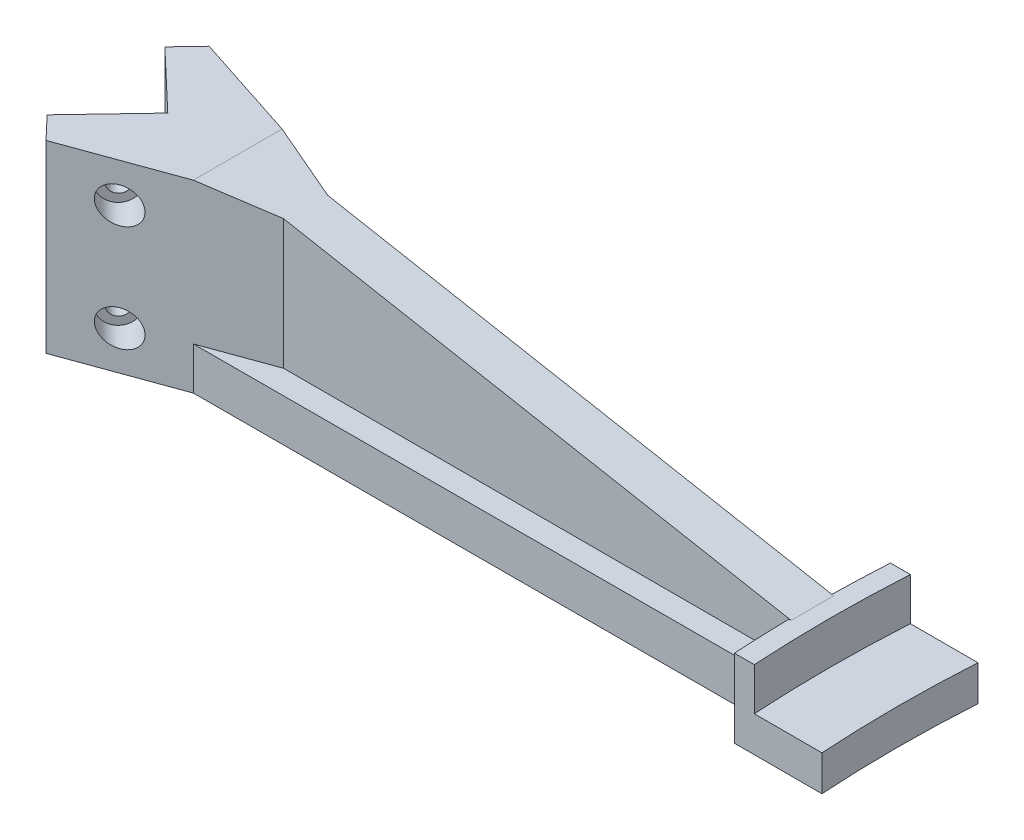
ISO-10303-21;
HEADER;
FILE_DESCRIPTION(('STEP AP214'),'2;1');
FILE_NAME('part.step','',(''),(''),'','','');
FILE_SCHEMA(('AUTOMOTIVE_DESIGN { 1 0 10303 214 1 1 1 1 }'));
ENDSEC;
DATA;
#1=APPLICATION_CONTEXT('core data for automotive mechanical design processes');
#2=APPLICATION_PROTOCOL_DEFINITION('international standard','automotive_design',2000,#1);
#3=PRODUCT_CONTEXT('',#1,'mechanical');
#4=PRODUCT('Part','Part','',(#3));
#5=PRODUCT_RELATED_PRODUCT_CATEGORY('part','',(#4));
#6=PRODUCT_DEFINITION_FORMATION('','',#4);
#7=PRODUCT_DEFINITION_CONTEXT('part definition',#1,'design');
#8=PRODUCT_DEFINITION('design','',#6,#7);
#9=PRODUCT_DEFINITION_SHAPE('','',#8);
#10=(LENGTH_UNIT() NAMED_UNIT(*) SI_UNIT(.MILLI.,.METRE.));
#11=(NAMED_UNIT(*) PLANE_ANGLE_UNIT() SI_UNIT($,.RADIAN.));
#12=(NAMED_UNIT(*) SI_UNIT($,.STERADIAN.) SOLID_ANGLE_UNIT());
#13=UNCERTAINTY_MEASURE_WITH_UNIT(LENGTH_MEASURE(1.E-05),#10,'distance_accuracy_value','');
#14=(GEOMETRIC_REPRESENTATION_CONTEXT(3) GLOBAL_UNCERTAINTY_ASSIGNED_CONTEXT((#13)) GLOBAL_UNIT_ASSIGNED_CONTEXT((#10,
#11,#12)) REPRESENTATION_CONTEXT('',''));
#15=CARTESIAN_POINT('',(0.,0.,0.));
#16=DIRECTION('',(0.,0.,1.));
#17=DIRECTION('',(1.,0.,0.));
#18=AXIS2_PLACEMENT_3D('',#15,#16,#17);
#19=CARTESIAN_POINT('',(-14.677433010329,-12.,-40.4115677614171));
#20=DIRECTION('',(0.341379794654496,0.,0.939925441618458));
#21=DIRECTION('',(0.939925441618459,0.,-0.341379794654496));
#22=AXIS2_PLACEMENT_3D('',#19,#20,#21);
#23=PLANE('',#22);
#24=CARTESIAN_POINT('',(-176.366171619887,29.,18.3135884482406));
#25=DIRECTION('',(0.341379794654496,0.,0.939925441618458));
#26=DIRECTION('',(-0.939925441618459,0.,0.341379794654496));
#27=AXIS2_PLACEMENT_3D('',#24,#25,#26);
#28=ELLIPSE('',#27,5.58738315295416,4.99999999999998);
#29=CARTESIAN_POINT('',(-181.617895197419,29.,20.2210081616521));
#30=VERTEX_POINT('',#29);
#31=EDGE_CURVE('E191',#30,#30,#28,.T.);
#32=ORIENTED_EDGE('',*,*,#31,.F.);
#33=EDGE_LOOP('',(#32));
#34=FACE_BOUND('',#33,.T.);
#35=CARTESIAN_POINT('',(-176.366171619887,-0.999999999999997,18.3135884482406));
#36=DIRECTION('',(0.341379794654496,0.,0.939925441618458));
#37=DIRECTION('',(-0.939925441618459,0.,0.341379794654496));
#38=AXIS2_PLACEMENT_3D('',#35,#36,#37);
#39=ELLIPSE('',#38,5.58738315295416,4.99999999999998);
#40=CARTESIAN_POINT('',(-181.617895197419,-0.999999999999997,20.2210081616521));
#41=VERTEX_POINT('',#40);
#42=EDGE_CURVE('E322',#41,#41,#39,.T.);
#43=ORIENTED_EDGE('',*,*,#42,.F.);
#44=EDGE_LOOP('',(#43));
#45=FACE_BOUND('',#44,.T.);
#46=DIRECTION('',(0.,1.,0.));
#47=VECTOR('',#46,1.);
#48=CARTESIAN_POINT('',(-142.463007925521,-12.,6.));
#49=LINE('',#48,#47);
#50=CARTESIAN_POINT('',(-142.463007925521,0.,6.));
#51=VERTEX_POINT('',#50);
#52=CARTESIAN_POINT('',(-142.463007925521,36.5394166426613,6.));
#53=VERTEX_POINT('',#52);
#54=EDGE_CURVE('E198',#51,#53,#49,.T.);
#55=ORIENTED_EDGE('',*,*,#54,.T.);
#56=DIRECTION('',(-0.925965204122098,0.171710199172954,0.336309453115885));
#57=VECTOR('',#56,1.);
#58=CARTESIAN_POINT('',(-10.72745892573,12.1104885833626,-41.8461936180905));
#59=LINE('',#58,#57);
#60=CARTESIAN_POINT('',(-161.12456554,40.,12.7778553747775));
#61=VERTEX_POINT('',#60);
#62=EDGE_CURVE('E185',#53,#61,#59,.T.);
#63=ORIENTED_EDGE('',*,*,#62,.T.);
#64=DIRECTION('',(0.939925441618459,0.,-0.341379794654496));
#65=VECTOR('',#64,1.);
#66=CARTESIAN_POINT('',(-14.677433010329,40.,-40.4115677614171));
#67=LINE('',#66,#65);
#68=CARTESIAN_POINT('',(-191.610767905309,40.,23.8504075607723));
#69=VERTEX_POINT('',#68);
#70=EDGE_CURVE('E196',#69,#61,#67,.T.);
#71=ORIENTED_EDGE('',*,*,#70,.F.);
#72=DIRECTION('',(0.,1.,0.));
#73=VECTOR('',#72,1.);
#74=CARTESIAN_POINT('',(-191.610767905309,-12.,23.8504075607723));
#75=LINE('',#74,#73);
#76=CARTESIAN_POINT('',(-191.610767905309,-12.,23.8504075607723));
#77=VERTEX_POINT('',#76);
#78=EDGE_CURVE('E296',#77,#69,#75,.T.);
#79=ORIENTED_EDGE('',*,*,#78,.F.);
#80=DIRECTION('',(0.939925441618459,0.,-0.341379794654496));
#81=VECTOR('',#80,1.);
#82=CARTESIAN_POINT('',(-14.677433010329,-12.,-40.4115677614171));
#83=LINE('',#82,#81);
#84=CARTESIAN_POINT('',(-161.12456554,-12.,12.7778553747776));
#85=VERTEX_POINT('',#84);
#86=EDGE_CURVE('E285',#77,#85,#83,.T.);
#87=ORIENTED_EDGE('',*,*,#86,.T.);
#88=DIRECTION('',(0.,1.,0.));
#89=VECTOR('',#88,1.);
#90=CARTESIAN_POINT('',(-161.12456554,-12.,12.7778553747776));
#91=LINE('',#90,#89);
#92=CARTESIAN_POINT('',(-161.12456554,0.,12.7778553747776));
#93=VERTEX_POINT('',#92);
#94=EDGE_CURVE('E293',#85,#93,#91,.T.);
#95=ORIENTED_EDGE('',*,*,#94,.T.);
#96=DIRECTION('',(0.939925441618459,0.,-0.341379794654496));
#97=VECTOR('',#96,1.);
#98=CARTESIAN_POINT('',(-14.677433010329,0.,-40.4115677614171));
#99=LINE('',#98,#97);
#100=EDGE_CURVE('E211',#93,#51,#99,.T.);
#101=ORIENTED_EDGE('',*,*,#100,.T.);
#102=EDGE_LOOP('',(#55,#63,#71,#79,#87,#95,#101));
#103=FACE_BOUND('',#102,.T.);
#104=ADVANCED_FACE('F39',(#34,#45,#103),#23,.T.);
#105=CARTESIAN_POINT('',(-11.8491370737928,-12.,36.3875184693806));
#106=DIRECTION('',(-0.309634199461379,0.,0.950855752742713));
#107=DIRECTION('',(0.950855752742713,0.,0.309634199461379));
#108=AXIS2_PLACEMENT_3D('',#105,#106,#107);
#109=PLANE('',#108);
#110=CARTESIAN_POINT('',(-177.25059753382,29.,-17.4733838300045));
#111=DIRECTION('',(-0.309634199461379,0.,0.950855752742713));
#112=DIRECTION('',(-0.950855752742713,0.,-0.309634199461379));
#113=AXIS2_PLACEMENT_3D('',#110,#111,#112);
#114=ELLIPSE('',#113,5.68578526215447,4.99999999999998);
#115=CARTESIAN_POINT('',(-182.656959159199,29.,-19.233897397961));
#116=VERTEX_POINT('',#115);
#117=EDGE_CURVE('E332',#116,#116,#114,.F.);
#118=ORIENTED_EDGE('',*,*,#117,.F.);
#119=EDGE_LOOP('',(#118));
#120=FACE_BOUND('',#119,.T.);
#121=CARTESIAN_POINT('',(-177.25059753382,-0.999999999999997,-17.4733838300045));
#122=DIRECTION('',(-0.309634199461379,0.,0.950855752742713));
#123=DIRECTION('',(-0.950855752742713,0.,-0.309634199461379));
#124=AXIS2_PLACEMENT_3D('',#121,#122,#123);
#125=ELLIPSE('',#124,5.68578526215447,4.99999999999998);
#126=CARTESIAN_POINT('',(-182.656959159199,-0.999999999999997,-19.233897397961));
#127=VERTEX_POINT('',#126);
#128=EDGE_CURVE('E337',#127,#127,#125,.F.);
#129=ORIENTED_EDGE('',*,*,#128,.F.);
#130=EDGE_LOOP('',(#129));
#131=FACE_BOUND('',#130,.T.);
#132=DIRECTION('',(-0.936410293348021,0.173647127627045,-0.304930217556));
#133=VECTOR('',#132,1.);
#134=CARTESIAN_POINT('',(-7.89482977141085,11.5852082444189,37.6751888362745));
#135=LINE('',#134,#133);
#136=CARTESIAN_POINT('',(-142.016979809542,36.4567055685404,-6.));
#137=VERTEX_POINT('',#136);
#138=CARTESIAN_POINT('',(-161.12456554,40.,-12.2221446252225));
#139=VERTEX_POINT('',#138);
#140=EDGE_CURVE('E56',#137,#139,#135,.T.);
#141=ORIENTED_EDGE('',*,*,#140,.F.);
#142=DIRECTION('',(0.,-1.,0.));
#143=VECTOR('',#142,1.);
#144=CARTESIAN_POINT('',(-142.016979809542,-12.,-6.));
#145=LINE('',#144,#143);
#146=CARTESIAN_POINT('',(-142.016979809542,0.,-6.));
#147=VERTEX_POINT('',#146);
#148=EDGE_CURVE('E214',#137,#147,#145,.T.);
#149=ORIENTED_EDGE('',*,*,#148,.T.);
#150=DIRECTION('',(0.950855752742713,0.,0.309634199461379));
#151=VECTOR('',#150,1.);
#152=CARTESIAN_POINT('',(-11.8491370737928,0.,36.3875184693806));
#153=LINE('',#152,#151);
#154=CARTESIAN_POINT('',(-161.12456554,0.,-12.2221446252224));
#155=VERTEX_POINT('',#154);
#156=EDGE_CURVE('E206',#155,#147,#153,.T.);
#157=ORIENTED_EDGE('',*,*,#156,.F.);
#158=DIRECTION('',(0.,1.,0.));
#159=VECTOR('',#158,1.);
#160=CARTESIAN_POINT('',(-161.12456554,-12.,-12.2221446252224));
#161=LINE('',#160,#159);
#162=CARTESIAN_POINT('',(-161.12456554,-12.,-12.2221446252224));
#163=VERTEX_POINT('',#162);
#164=EDGE_CURVE('E306',#163,#155,#161,.T.);
#165=ORIENTED_EDGE('',*,*,#164,.F.);
#166=DIRECTION('',(0.950855752742713,0.,0.309634199461379));
#167=VECTOR('',#166,1.);
#168=CARTESIAN_POINT('',(-11.8491370737928,-12.,36.3875184693806));
#169=LINE('',#168,#167);
#170=CARTESIAN_POINT('',(-191.610767905309,-12.,-22.1495924392277));
#171=VERTEX_POINT('',#170);
#172=EDGE_CURVE('E273',#171,#163,#169,.T.);
#173=ORIENTED_EDGE('',*,*,#172,.F.);
#174=DIRECTION('',(0.,1.,0.));
#175=VECTOR('',#174,1.);
#176=CARTESIAN_POINT('',(-191.610767905309,-12.,-22.1495924392277));
#177=LINE('',#176,#175);
#178=CARTESIAN_POINT('',(-191.610767905309,40.,-22.1495924392277));
#179=VERTEX_POINT('',#178);
#180=EDGE_CURVE('E304',#171,#179,#177,.T.);
#181=ORIENTED_EDGE('',*,*,#180,.T.);
#182=DIRECTION('',(0.950855752742713,0.,0.309634199461379));
#183=VECTOR('',#182,1.);
#184=CARTESIAN_POINT('',(-11.8491370737928,40.,36.3875184693806));
#185=LINE('',#184,#183);
#186=EDGE_CURVE('E205',#179,#139,#185,.T.);
#187=ORIENTED_EDGE('',*,*,#186,.T.);
#188=EDGE_LOOP('',(#141,#149,#157,#165,#173,#181,#187));
#189=FACE_BOUND('',#188,.T.);
#190=ADVANCED_FACE('F394',(#120,#131,#189),#109,.F.);
#191=CARTESIAN_POINT('',(0.,40.,0.));
#192=DIRECTION('',(0.,1.,0.));
#193=DIRECTION('',(0.,0.,1.));
#194=AXIS2_PLACEMENT_3D('',#191,#192,#193);
#195=PLANE('',#194);
#196=ORIENTED_EDGE('',*,*,#70,.T.);
#197=DIRECTION('',(0.,0.,1.));
#198=VECTOR('',#197,1.);
#199=CARTESIAN_POINT('',(-161.12456554,40.,-22.1495924392277));
#200=LINE('',#199,#198);
#201=EDGE_CURVE('E181',#139,#61,#200,.T.);
#202=ORIENTED_EDGE('',*,*,#201,.F.);
#203=ORIENTED_EDGE('',*,*,#186,.F.);
#204=DIRECTION('',(0.688749461914691,0.,-0.724999433594415));
#205=VECTOR('',#204,1.);
#206=CARTESIAN_POINT('',(-111.775495780592,40.,-106.186720991562));
#207=LINE('',#206,#205);
#208=CARTESIAN_POINT('',(-197.696610314021,40.,-15.74344253532));
#209=VERTEX_POINT('',#208);
#210=EDGE_CURVE('E208',#209,#179,#207,.T.);
#211=ORIENTED_EDGE('',*,*,#210,.F.);
#212=DIRECTION('',(-0.724999433594415,0.,-0.688749461914691));
#213=VECTOR('',#212,1.);
#214=CARTESIAN_POINT('',(-85.9211145334293,40.,90.4432784562418));
#215=LINE('',#214,#213);
#216=CARTESIAN_POINT('',(-181.12456554,40.,0.));
#217=VERTEX_POINT('',#216);
#218=EDGE_CURVE('E219',#217,#209,#215,.T.);
#219=ORIENTED_EDGE('',*,*,#218,.F.);
#220=DIRECTION('',(-0.688749461914691,0.,0.724999433594416));
#221=VECTOR('',#220,1.);
#222=CARTESIAN_POINT('',(-95.2034510065709,40.,-90.4432784562417));
#223=LINE('',#222,#221);
#224=CARTESIAN_POINT('',(-197.696610314021,40.,17.4442576568645));
#225=VERTEX_POINT('',#224);
#226=EDGE_CURVE('E222',#217,#225,#223,.T.);
#227=ORIENTED_EDGE('',*,*,#226,.T.);
#228=DIRECTION('',(0.688749461914691,0.,0.724999433594415));
#229=VECTOR('',#228,1.);
#230=CARTESIAN_POINT('',(-112.624785854425,40.,106.993546561703));
#231=LINE('',#230,#229);
#232=EDGE_CURVE('E204',#225,#69,#231,.T.);
#233=ORIENTED_EDGE('',*,*,#232,.T.);
#234=EDGE_LOOP('',(#196,#202,#203,#211,#219,#227,#233));
#235=FACE_BOUND('',#234,.T.);
#236=ADVANCED_FACE('F201',(#235),#195,.T.);
#237=CARTESIAN_POINT('',(0.,0.,0.));
#238=DIRECTION('',(0.,1.,0.));
#239=DIRECTION('',(0.,0.,1.));
#240=AXIS2_PLACEMENT_3D('',#237,#238,#239);
#241=PLANE('',#240);
#242=CARTESIAN_POINT('',(370.6,0.,0.));
#243=DIRECTION('',(0.,1.,0.));
#244=DIRECTION('',(0.,0.,1.));
#245=AXIS2_PLACEMENT_3D('',#242,#243,#244);
#246=CIRCLE('',#245,370.6);
#247=CARTESIAN_POINT('',(0.210866790074399,0.,12.5));
#248=VERTEX_POINT('',#247);
#249=CARTESIAN_POINT('',(0.0485730698099318,0.,6.));
#250=VERTEX_POINT('',#249);
#251=EDGE_CURVE('E11',#248,#250,#246,.F.);
#252=ORIENTED_EDGE('',*,*,#251,.T.);
#253=DIRECTION('',(1.,0.,0.));
#254=VECTOR('',#253,1.);
#255=CARTESIAN_POINT('',(-161.12456554,0.,6.));
#256=LINE('',#255,#254);
#257=EDGE_CURVE('E373',#51,#250,#256,.T.);
#258=ORIENTED_EDGE('',*,*,#257,.F.);
#259=ORIENTED_EDGE('',*,*,#100,.F.);
#260=DIRECTION('',(0.99999851697959,0.,-0.00172221909781054));
#261=VECTOR('',#260,1.);
#262=CARTESIAN_POINT('',(0.021528332235599,0.,12.5003260827916));
#263=LINE('',#262,#261);
#264=EDGE_CURVE('E258',#93,#248,#263,.T.);
#265=ORIENTED_EDGE('',*,*,#264,.T.);
#266=EDGE_LOOP('',(#252,#258,#259,#265));
#267=FACE_BOUND('',#266,.T.);
#268=ADVANCED_FACE('F438',(#267),#241,.T.);
#269=CARTESIAN_POINT('',(370.6,-12.,0.));
#270=DIRECTION('',(0.,1.,0.));
#271=DIRECTION('',(0.,0.,1.));
#272=AXIS2_PLACEMENT_3D('',#269,#270,#271);
#273=CYLINDRICAL_SURFACE('',#272,370.6);
#274=CARTESIAN_POINT('',(370.6,10.,0.));
#275=DIRECTION('',(0.,1.,0.));
#276=DIRECTION('',(0.,0.,1.));
#277=AXIS2_PLACEMENT_3D('',#274,#275,#276);
#278=CIRCLE('',#277,370.6);
#279=CARTESIAN_POINT('',(0.0485730698099318,10.,6.));
#280=VERTEX_POINT('',#279);
#281=CARTESIAN_POINT('',(0.653571445810575,10.,21.9999999999998));
#282=VERTEX_POINT('',#281);
#283=EDGE_CURVE('E235',#280,#282,#278,.T.);
#284=ORIENTED_EDGE('',*,*,#283,.F.);
#285=DIRECTION('',(0.,1.,0.));
#286=VECTOR('',#285,1.);
#287=CARTESIAN_POINT('',(0.0485730698099318,-12.,6.));
#288=LINE('',#287,#286);
#289=EDGE_CURVE('E64',#280,#250,#288,.F.);
#290=ORIENTED_EDGE('',*,*,#289,.T.);
#291=ORIENTED_EDGE('',*,*,#251,.F.);
#292=DIRECTION('',(0.,1.,0.));
#293=VECTOR('',#292,1.);
#294=CARTESIAN_POINT('',(0.210866790074399,-12.,12.5));
#295=LINE('',#294,#293);
#296=CARTESIAN_POINT('',(0.210866790074399,-12.,12.5));
#297=VERTEX_POINT('',#296);
#298=EDGE_CURVE('E288',#297,#248,#295,.T.);
#299=ORIENTED_EDGE('',*,*,#298,.F.);
#300=CARTESIAN_POINT('',(370.6,-12.,0.));
#301=DIRECTION('',(0.,1.,0.));
#302=DIRECTION('',(0.,0.,1.));
#303=AXIS2_PLACEMENT_3D('',#300,#301,#302);
#304=CIRCLE('',#303,370.6);
#305=CARTESIAN_POINT('',(0.653571445810575,-12.,22.));
#306=VERTEX_POINT('',#305);
#307=EDGE_CURVE('E262',#297,#306,#304,.T.);
#308=ORIENTED_EDGE('',*,*,#307,.T.);
#309=DIRECTION('',(0.,1.,0.));
#310=VECTOR('',#309,1.);
#311=CARTESIAN_POINT('',(0.653571445810575,-12.,22.));
#312=LINE('',#311,#310);
#313=EDGE_CURVE('E318',#306,#282,#312,.T.);
#314=ORIENTED_EDGE('',*,*,#313,.T.);
#315=EDGE_LOOP('',(#284,#290,#291,#299,#308,#314));
#316=FACE_BOUND('',#315,.T.);
#317=ADVANCED_FACE('F442',(#316),#273,.T.);
#318=DIRECTION('',(1.,0.,0.));
#319=VECTOR('',#318,1.);
#320=CARTESIAN_POINT('',(-161.12456554,0.,-6.));
#321=LINE('',#320,#319);
#322=CARTESIAN_POINT('',(0.0485730698099318,0.,-6.));
#323=VERTEX_POINT('',#322);
#324=EDGE_CURVE('E377',#147,#323,#321,.T.);
#325=ORIENTED_EDGE('',*,*,#324,.T.);
#326=CARTESIAN_POINT('',(0.210866790074427,0.,-12.5));
#327=VERTEX_POINT('',#326);
#328=EDGE_CURVE('E48',#323,#327,#246,.F.);
#329=ORIENTED_EDGE('',*,*,#328,.T.);
#330=DIRECTION('',(0.99999851697959,0.,-0.00172221909781055));
#331=VECTOR('',#330,1.);
#332=CARTESIAN_POINT('',(-0.0215270813575127,0.,-12.4995997662429));
#333=LINE('',#332,#331);
#334=EDGE_CURVE('E263',#155,#327,#333,.T.);
#335=ORIENTED_EDGE('',*,*,#334,.F.);
#336=ORIENTED_EDGE('',*,*,#156,.T.);
#337=EDGE_LOOP('',(#325,#329,#335,#336));
#338=FACE_BOUND('',#337,.T.);
#339=ADVANCED_FACE('F399',(#338),#241,.T.);
#340=CARTESIAN_POINT('',(0.021528332235599,-12.,12.5003260827916));
#341=DIRECTION('',(0.00172221909781054,0.,0.99999851697959));
#342=DIRECTION('',(0.99999851697959,0.,-0.00172221909781054));
#343=AXIS2_PLACEMENT_3D('',#340,#341,#342);
#344=PLANE('',#343);
#345=ORIENTED_EDGE('',*,*,#264,.F.);
#346=ORIENTED_EDGE('',*,*,#94,.F.);
#347=DIRECTION('',(0.99999851697959,0.,-0.00172221909781054));
#348=VECTOR('',#347,1.);
#349=CARTESIAN_POINT('',(0.021528332235599,-12.,12.5003260827916));
#350=LINE('',#349,#348);
#351=EDGE_CURVE('E259',#85,#297,#350,.T.);
#352=ORIENTED_EDGE('',*,*,#351,.T.);
#353=ORIENTED_EDGE('',*,*,#298,.T.);
#354=EDGE_LOOP('',(#345,#346,#352,#353));
#355=FACE_BOUND('',#354,.T.);
#356=ADVANCED_FACE('F41',(#355),#344,.T.);
#357=CARTESIAN_POINT('',(-112.624785854425,-12.,106.993546561703));
#358=DIRECTION('',(-0.724999433594415,0.,0.688749461914691));
#359=DIRECTION('',(0.688749461914691,0.,0.724999433594415));
#360=AXIS2_PLACEMENT_3D('',#357,#358,#359);
#361=PLANE('',#360);
#362=ORIENTED_EDGE('',*,*,#78,.T.);
#363=ORIENTED_EDGE('',*,*,#232,.F.);
#364=DIRECTION('',(0.,1.,0.));
#365=VECTOR('',#364,1.);
#366=CARTESIAN_POINT('',(-197.696610314021,-12.,17.4442576568645));
#367=LINE('',#366,#365);
#368=CARTESIAN_POINT('',(-197.696610314021,-12.,17.4442576568645));
#369=VERTEX_POINT('',#368);
#370=EDGE_CURVE('E298',#369,#225,#367,.T.);
#371=ORIENTED_EDGE('',*,*,#370,.F.);
#372=DIRECTION('',(0.688749461914691,0.,0.724999433594415));
#373=VECTOR('',#372,1.);
#374=CARTESIAN_POINT('',(-112.624785854425,-12.,106.993546561703));
#375=LINE('',#374,#373);
#376=EDGE_CURVE('E282',#369,#77,#375,.T.);
#377=ORIENTED_EDGE('',*,*,#376,.T.);
#378=EDGE_LOOP('',(#362,#363,#371,#377));
#379=FACE_BOUND('',#378,.T.);
#380=ADVANCED_FACE('F428',(#379),#361,.T.);
#381=CARTESIAN_POINT('',(-95.2034510065709,-12.,-90.4432784562417));
#382=DIRECTION('',(-0.724999433594416,0.,-0.688749461914691));
#383=DIRECTION('',(-0.688749461914691,0.,0.724999433594416));
#384=AXIS2_PLACEMENT_3D('',#381,#382,#383);
#385=PLANE('',#384);
#386=CARTESIAN_POINT('',(-188.012060159147,29.,7.24999433594418));
#387=DIRECTION('',(-0.724999433594416,0.,-0.688749461914691));
#388=DIRECTION('',(-0.688749461914691,0.,0.724999433594416));
#389=AXIS2_PLACEMENT_3D('',#386,#387,#388);
#390=CIRCLE('',#389,2.75000000000001);
#391=CARTESIAN_POINT('',(-189.906121179412,29.,9.24374277832884));
#392=VERTEX_POINT('',#391);
#393=EDGE_CURVE('E331',#392,#392,#390,.T.);
#394=ORIENTED_EDGE('',*,*,#393,.F.);
#395=EDGE_LOOP('',(#394));
#396=FACE_BOUND('',#395,.T.);
#397=CARTESIAN_POINT('',(-188.012060159147,-0.999999999999997,7.24999433594418));
#398=DIRECTION('',(-0.724999433594416,0.,-0.688749461914691));
#399=DIRECTION('',(-0.688749461914691,0.,0.724999433594416));
#400=AXIS2_PLACEMENT_3D('',#397,#398,#399);
#401=CIRCLE('',#400,2.75000000000001);
#402=CARTESIAN_POINT('',(-189.906121179412,-0.999999999999997,9.24374277832884));
#403=VERTEX_POINT('',#402);
#404=EDGE_CURVE('E336',#403,#403,#401,.T.);
#405=ORIENTED_EDGE('',*,*,#404,.F.);
#406=EDGE_LOOP('',(#405));
#407=FACE_BOUND('',#406,.T.);
#408=ORIENTED_EDGE('',*,*,#370,.T.);
#409=ORIENTED_EDGE('',*,*,#226,.F.);
#410=DIRECTION('',(0.,1.,0.));
#411=VECTOR('',#410,1.);
#412=CARTESIAN_POINT('',(-181.12456554,-12.,0.));
#413=LINE('',#412,#411);
#414=CARTESIAN_POINT('',(-181.12456554,-12.,0.));
#415=VERTEX_POINT('',#414);
#416=EDGE_CURVE('E300',#415,#217,#413,.T.);
#417=ORIENTED_EDGE('',*,*,#416,.F.);
#418=DIRECTION('',(-0.688749461914691,0.,0.724999433594416));
#419=VECTOR('',#418,1.);
#420=CARTESIAN_POINT('',(-95.2034510065709,-12.,-90.4432784562417));
#421=LINE('',#420,#419);
#422=EDGE_CURVE('E279',#415,#369,#421,.T.);
#423=ORIENTED_EDGE('',*,*,#422,.T.);
#424=EDGE_LOOP('',(#408,#409,#417,#423));
#425=FACE_BOUND('',#424,.T.);
#426=ADVANCED_FACE('F491',(#396,#407,#425),#385,.T.);
#427=CARTESIAN_POINT('',(-85.9211145334293,-12.,90.4432784562418));
#428=DIRECTION('',(0.688749461914691,0.,-0.724999433594415));
#429=DIRECTION('',(-0.724999433594415,0.,-0.688749461914691));
#430=AXIS2_PLACEMENT_3D('',#427,#428,#429);
#431=PLANE('',#430);
#432=CARTESIAN_POINT('',(-188.384099342176,29.,-6.89655711206684));
#433=DIRECTION('',(0.688749461914691,0.,-0.724999433594415));
#434=DIRECTION('',(-0.724999433594415,0.,-0.688749461914691));
#435=AXIS2_PLACEMENT_3D('',#432,#433,#434);
#436=ELLIPSE('',#435,2.75361842105264,2.75000000000001);
#437=CARTESIAN_POINT('',(-190.380471137774,29.,-8.79311031788523));
#438=VERTEX_POINT('',#437);
#439=EDGE_CURVE('E344',#438,#438,#436,.F.);
#440=ORIENTED_EDGE('',*,*,#439,.F.);
#441=EDGE_LOOP('',(#440));
#442=FACE_BOUND('',#441,.T.);
#443=CARTESIAN_POINT('',(-188.384099342176,-0.999999999999997,-6.89655711206684));
#444=DIRECTION('',(0.688749461914691,0.,-0.724999433594415));
#445=DIRECTION('',(-0.724999433594415,0.,-0.688749461914691));
#446=AXIS2_PLACEMENT_3D('',#443,#444,#445);
#447=ELLIPSE('',#446,2.75361842105264,2.75000000000001);
#448=CARTESIAN_POINT('',(-190.380471137774,-0.999999999999997,-8.79311031788523));
#449=VERTEX_POINT('',#448);
#450=EDGE_CURVE('E352',#449,#449,#447,.F.);
#451=ORIENTED_EDGE('',*,*,#450,.F.);
#452=EDGE_LOOP('',(#451));
#453=FACE_BOUND('',#452,.T.);
#454=ORIENTED_EDGE('',*,*,#416,.T.);
#455=ORIENTED_EDGE('',*,*,#218,.T.);
#456=DIRECTION('',(0.,1.,0.));
#457=VECTOR('',#456,1.);
#458=CARTESIAN_POINT('',(-197.696610314021,-12.,-15.74344253532));
#459=LINE('',#458,#457);
#460=CARTESIAN_POINT('',(-197.696610314021,-12.,-15.74344253532));
#461=VERTEX_POINT('',#460);
#462=EDGE_CURVE('E302',#461,#209,#459,.T.);
#463=ORIENTED_EDGE('',*,*,#462,.F.);
#464=DIRECTION('',(-0.724999433594415,0.,-0.688749461914691));
#465=VECTOR('',#464,1.);
#466=CARTESIAN_POINT('',(-85.9211145334293,-12.,90.4432784562418));
#467=LINE('',#466,#465);
#468=EDGE_CURVE('E277',#415,#461,#467,.T.);
#469=ORIENTED_EDGE('',*,*,#468,.F.);
#470=EDGE_LOOP('',(#454,#455,#463,#469));
#471=FACE_BOUND('',#470,.T.);
#472=ADVANCED_FACE('F423',(#442,#453,#471),#431,.F.);
#473=CARTESIAN_POINT('',(-111.775495780592,-12.,-106.186720991562));
#474=DIRECTION('',(0.724999433594415,0.,0.688749461914691));
#475=DIRECTION('',(0.688749461914691,0.,-0.724999433594415));
#476=AXIS2_PLACEMENT_3D('',#473,#474,#475);
#477=PLANE('',#476);
#478=ORIENTED_EDGE('',*,*,#462,.T.);
#479=ORIENTED_EDGE('',*,*,#210,.T.);
#480=ORIENTED_EDGE('',*,*,#180,.F.);
#481=DIRECTION('',(0.688749461914691,0.,-0.724999433594415));
#482=VECTOR('',#481,1.);
#483=CARTESIAN_POINT('',(-111.775495780592,-12.,-106.186720991562));
#484=LINE('',#483,#482);
#485=EDGE_CURVE('E275',#461,#171,#484,.T.);
#486=ORIENTED_EDGE('',*,*,#485,.F.);
#487=EDGE_LOOP('',(#478,#479,#480,#486));
#488=FACE_BOUND('',#487,.T.);
#489=ADVANCED_FACE('F419',(#488),#477,.F.);
#490=CARTESIAN_POINT('',(-0.0215270813575127,-12.,-12.4995997662429));
#491=DIRECTION('',(0.00172221909781055,0.,0.99999851697959));
#492=DIRECTION('',(0.99999851697959,0.,-0.00172221909781055));
#493=AXIS2_PLACEMENT_3D('',#490,#491,#492);
#494=PLANE('',#493);
#495=ORIENTED_EDGE('',*,*,#334,.T.);
#496=DIRECTION('',(0.,1.,0.));
#497=VECTOR('',#496,1.);
#498=CARTESIAN_POINT('',(0.210866790074399,-12.,-12.5));
#499=LINE('',#498,#497);
#500=CARTESIAN_POINT('',(0.210866790074399,-12.,-12.5));
#501=VERTEX_POINT('',#500);
#502=EDGE_CURVE('E309',#501,#327,#499,.T.);
#503=ORIENTED_EDGE('',*,*,#502,.F.);
#504=DIRECTION('',(0.99999851697959,0.,-0.00172221909781055));
#505=VECTOR('',#504,1.);
#506=CARTESIAN_POINT('',(-0.0215270813575127,-12.,-12.4995997662429));
#507=LINE('',#506,#505);
#508=EDGE_CURVE('E271',#163,#501,#507,.T.);
#509=ORIENTED_EDGE('',*,*,#508,.F.);
#510=ORIENTED_EDGE('',*,*,#164,.T.);
#511=EDGE_LOOP('',(#495,#503,#509,#510));
#512=FACE_BOUND('',#511,.T.);
#513=ADVANCED_FACE('F403',(#512),#494,.F.);
#514=DIRECTION('',(0.,1.,0.));
#515=VECTOR('',#514,1.);
#516=CARTESIAN_POINT('',(0.0485730698099318,-12.,-6.));
#517=LINE('',#516,#515);
#518=CARTESIAN_POINT('',(0.0485730698099318,10.,-6.));
#519=VERTEX_POINT('',#518);
#520=EDGE_CURVE('E388',#519,#323,#517,.F.);
#521=ORIENTED_EDGE('',*,*,#520,.F.);
#522=CARTESIAN_POINT('',(0.653571445810575,10.,-22.));
#523=VERTEX_POINT('',#522);
#524=EDGE_CURVE('E236',#523,#519,#278,.T.);
#525=ORIENTED_EDGE('',*,*,#524,.F.);
#526=DIRECTION('',(0.,1.,0.));
#527=VECTOR('',#526,1.);
#528=CARTESIAN_POINT('',(0.653571445810575,-12.,-22.));
#529=LINE('',#528,#527);
#530=CARTESIAN_POINT('',(0.653571445810575,-12.,-22.));
#531=VERTEX_POINT('',#530);
#532=EDGE_CURVE('E312',#531,#523,#529,.T.);
#533=ORIENTED_EDGE('',*,*,#532,.F.);
#534=EDGE_CURVE('E267',#531,#501,#304,.T.);
#535=ORIENTED_EDGE('',*,*,#534,.T.);
#536=ORIENTED_EDGE('',*,*,#502,.T.);
#537=ORIENTED_EDGE('',*,*,#328,.F.);
#538=EDGE_LOOP('',(#521,#525,#533,#535,#536,#537));
#539=FACE_BOUND('',#538,.T.);
#540=ADVANCED_FACE('F407',(#539),#273,.T.);
#541=CARTESIAN_POINT('',(0.,-12.,-22.));
#542=DIRECTION('',(0.,0.,1.));
#543=DIRECTION('',(1.,0.,0.));
#544=AXIS2_PLACEMENT_3D('',#541,#542,#543);
#545=PLANE('',#544);
#546=DIRECTION('',(0.,-1.,0.));
#547=VECTOR('',#546,1.);
#548=CARTESIAN_POINT('',(25.3402114349254,-2.,-22.));
#549=LINE('',#548,#547);
#550=CARTESIAN_POINT('',(25.3402114349254,-2.,-22.));
#551=VERTEX_POINT('',#550);
#552=CARTESIAN_POINT('',(25.3402114349254,-12.,-22.));
#553=VERTEX_POINT('',#552);
#554=EDGE_CURVE('E250',#551,#553,#549,.T.);
#555=ORIENTED_EDGE('',*,*,#554,.T.);
#556=DIRECTION('',(1.,0.,0.));
#557=VECTOR('',#556,1.);
#558=CARTESIAN_POINT('',(0.,-12.,-22.));
#559=LINE('',#558,#557);
#560=EDGE_CURVE('E269',#531,#553,#559,.T.);
#561=ORIENTED_EDGE('',*,*,#560,.F.);
#562=ORIENTED_EDGE('',*,*,#532,.T.);
#563=DIRECTION('',(1.,0.,0.));
#564=VECTOR('',#563,1.);
#565=CARTESIAN_POINT('',(0.,10.,-22.));
#566=LINE('',#565,#564);
#567=CARTESIAN_POINT('',(6.26361696915306,10.,-22.));
#568=VERTEX_POINT('',#567);
#569=EDGE_CURVE('E232',#523,#568,#566,.T.);
#570=ORIENTED_EDGE('',*,*,#569,.T.);
#571=DIRECTION('',(0.,1.,0.));
#572=VECTOR('',#571,1.);
#573=CARTESIAN_POINT('',(6.26361696915312,-12.,-22.));
#574=LINE('',#573,#572);
#575=CARTESIAN_POINT('',(6.26361696915306,-2.,-22.));
#576=VERTEX_POINT('',#575);
#577=EDGE_CURVE('E314',#576,#568,#574,.T.);
#578=ORIENTED_EDGE('',*,*,#577,.F.);
#579=DIRECTION('',(1.,0.,0.));
#580=VECTOR('',#579,1.);
#581=CARTESIAN_POINT('',(0.,-2.,-22.));
#582=LINE('',#581,#580);
#583=EDGE_CURVE('E245',#576,#551,#582,.T.);
#584=ORIENTED_EDGE('',*,*,#583,.T.);
#585=EDGE_LOOP('',(#555,#561,#562,#570,#578,#584));
#586=FACE_BOUND('',#585,.T.);
#587=ADVANCED_FACE('F453',(#586),#545,.F.);
#588=CARTESIAN_POINT('',(370.6,-12.,0.));
#589=DIRECTION('',(0.,1.,0.));
#590=DIRECTION('',(0.,0.,1.));
#591=AXIS2_PLACEMENT_3D('',#588,#589,#590);
#592=CYLINDRICAL_SURFACE('',#591,365.);
#593=DIRECTION('',(0.,1.,0.));
#594=VECTOR('',#593,1.);
#595=CARTESIAN_POINT('',(6.26361696915312,-12.,22.));
#596=LINE('',#595,#594);
#597=CARTESIAN_POINT('',(6.26361696915306,-2.,21.9999999999999));
#598=VERTEX_POINT('',#597);
#599=CARTESIAN_POINT('',(6.26361696915306,10.,21.9999999999999));
#600=VERTEX_POINT('',#599);
#601=EDGE_CURVE('E316',#598,#600,#596,.T.);
#602=ORIENTED_EDGE('',*,*,#601,.F.);
#603=CARTESIAN_POINT('',(370.6,-2.,0.));
#604=DIRECTION('',(0.,1.,0.));
#605=DIRECTION('',(0.,0.,1.));
#606=AXIS2_PLACEMENT_3D('',#603,#604,#605);
#607=CIRCLE('',#606,365.);
#608=EDGE_CURVE('E248',#576,#598,#607,.T.);
#609=ORIENTED_EDGE('',*,*,#608,.F.);
#610=ORIENTED_EDGE('',*,*,#577,.T.);
#611=CARTESIAN_POINT('',(370.6,10.,0.));
#612=DIRECTION('',(0.,1.,0.));
#613=DIRECTION('',(0.,0.,1.));
#614=AXIS2_PLACEMENT_3D('',#611,#612,#613);
#615=CIRCLE('',#614,365.);
#616=EDGE_CURVE('E229',#568,#600,#615,.T.);
#617=ORIENTED_EDGE('',*,*,#616,.T.);
#618=EDGE_LOOP('',(#602,#609,#610,#617));
#619=FACE_BOUND('',#618,.T.);
#620=ADVANCED_FACE('F465',(#619),#592,.F.);
#621=CARTESIAN_POINT('',(0.,-12.,22.));
#622=DIRECTION('',(0.,0.,1.));
#623=DIRECTION('',(1.,0.,0.));
#624=AXIS2_PLACEMENT_3D('',#621,#622,#623);
#625=PLANE('',#624);
#626=DIRECTION('',(1.,0.,0.));
#627=VECTOR('',#626,1.);
#628=CARTESIAN_POINT('',(0.,-2.,22.));
#629=LINE('',#628,#627);
#630=CARTESIAN_POINT('',(25.3402114349254,-2.,21.9999999999998));
#631=VERTEX_POINT('',#630);
#632=EDGE_CURVE('E240',#598,#631,#629,.T.);
#633=ORIENTED_EDGE('',*,*,#632,.F.);
#634=ORIENTED_EDGE('',*,*,#601,.T.);
#635=DIRECTION('',(1.,0.,0.));
#636=VECTOR('',#635,1.);
#637=CARTESIAN_POINT('',(0.,10.,22.));
#638=LINE('',#637,#636);
#639=EDGE_CURVE('E225',#282,#600,#638,.T.);
#640=ORIENTED_EDGE('',*,*,#639,.F.);
#641=ORIENTED_EDGE('',*,*,#313,.F.);
#642=DIRECTION('',(1.,0.,0.));
#643=VECTOR('',#642,1.);
#644=CARTESIAN_POINT('',(0.,-12.,22.));
#645=LINE('',#644,#643);
#646=CARTESIAN_POINT('',(25.3402114349254,-12.,21.9999999999998));
#647=VERTEX_POINT('',#646);
#648=EDGE_CURVE('E266',#306,#647,#645,.T.);
#649=ORIENTED_EDGE('',*,*,#648,.T.);
#650=DIRECTION('',(0.,-1.,0.));
#651=VECTOR('',#650,1.);
#652=CARTESIAN_POINT('',(25.3402114349254,-2.,21.9999999999998));
#653=LINE('',#652,#651);
#654=EDGE_CURVE('E255',#631,#647,#653,.T.);
#655=ORIENTED_EDGE('',*,*,#654,.F.);
#656=EDGE_LOOP('',(#633,#634,#640,#641,#649,#655));
#657=FACE_BOUND('',#656,.T.);
#658=ADVANCED_FACE('F461',(#657),#625,.T.);
#659=CARTESIAN_POINT('',(0.,-12.,0.));
#660=DIRECTION('',(0.,1.,0.));
#661=DIRECTION('',(0.,0.,1.));
#662=AXIS2_PLACEMENT_3D('',#659,#660,#661);
#663=PLANE('',#662);
#664=CARTESIAN_POINT('',(370.6,-12.,0.));
#665=DIRECTION('',(0.,1.,0.));
#666=DIRECTION('',(0.,0.,1.));
#667=AXIS2_PLACEMENT_3D('',#664,#665,#666);
#668=CIRCLE('',#667,345.96);
#669=EDGE_CURVE('E239',#553,#647,#668,.T.);
#670=ORIENTED_EDGE('',*,*,#669,.T.);
#671=ORIENTED_EDGE('',*,*,#648,.F.);
#672=ORIENTED_EDGE('',*,*,#307,.F.);
#673=ORIENTED_EDGE('',*,*,#351,.F.);
#674=ORIENTED_EDGE('',*,*,#86,.F.);
#675=ORIENTED_EDGE('',*,*,#376,.F.);
#676=ORIENTED_EDGE('',*,*,#422,.F.);
#677=ORIENTED_EDGE('',*,*,#468,.T.);
#678=ORIENTED_EDGE('',*,*,#485,.T.);
#679=ORIENTED_EDGE('',*,*,#172,.T.);
#680=ORIENTED_EDGE('',*,*,#508,.T.);
#681=ORIENTED_EDGE('',*,*,#534,.F.);
#682=ORIENTED_EDGE('',*,*,#560,.T.);
#683=EDGE_LOOP('',(#670,#671,#672,#673,#674,#675,#676,#677,#678,#679,#680,#681,#682));
#684=FACE_BOUND('',#683,.T.);
#685=ADVANCED_FACE('F412',(#684),#663,.F.);
#686=CARTESIAN_POINT('',(370.6,-2.,0.));
#687=DIRECTION('',(0.,-1.,0.));
#688=DIRECTION('',(0.,0.,-1.));
#689=AXIS2_PLACEMENT_3D('',#686,#687,#688);
#690=CYLINDRICAL_SURFACE('',#689,345.96);
#691=ORIENTED_EDGE('',*,*,#669,.F.);
#692=ORIENTED_EDGE('',*,*,#554,.F.);
#693=CARTESIAN_POINT('',(370.6,-2.,0.));
#694=DIRECTION('',(0.,1.,0.));
#695=DIRECTION('',(0.,0.,1.));
#696=AXIS2_PLACEMENT_3D('',#693,#694,#695);
#697=CIRCLE('',#696,345.96);
#698=EDGE_CURVE('E242',#551,#631,#697,.T.);
#699=ORIENTED_EDGE('',*,*,#698,.T.);
#700=ORIENTED_EDGE('',*,*,#654,.T.);
#701=EDGE_LOOP('',(#691,#692,#699,#700));
#702=FACE_BOUND('',#701,.T.);
#703=ADVANCED_FACE('F457',(#702),#690,.F.);
#704=CARTESIAN_POINT('',(370.6,-2.,0.));
#705=DIRECTION('',(0.,1.,0.));
#706=DIRECTION('',(0.,0.,1.));
#707=AXIS2_PLACEMENT_3D('',#704,#705,#706);
#708=PLANE('',#707);
#709=ORIENTED_EDGE('',*,*,#632,.T.);
#710=ORIENTED_EDGE('',*,*,#698,.F.);
#711=ORIENTED_EDGE('',*,*,#583,.F.);
#712=ORIENTED_EDGE('',*,*,#608,.T.);
#713=EDGE_LOOP('',(#709,#710,#711,#712));
#714=FACE_BOUND('',#713,.T.);
#715=ADVANCED_FACE('F467',(#714),#708,.T.);
#716=CARTESIAN_POINT('',(370.6,10.,0.));
#717=DIRECTION('',(0.,1.,0.));
#718=DIRECTION('',(0.,0.,1.));
#719=AXIS2_PLACEMENT_3D('',#716,#717,#718);
#720=PLANE('',#719);
#721=DIRECTION('',(0.,0.,1.));
#722=VECTOR('',#721,1.);
#723=CARTESIAN_POINT('',(0.653571445810575,10.,-6.));
#724=LINE('',#723,#722);
#725=CARTESIAN_POINT('',(0.653571445810575,10.,-6.));
#726=VERTEX_POINT('',#725);
#727=CARTESIAN_POINT('',(0.653571445810575,10.,6.));
#728=VERTEX_POINT('',#727);
#729=EDGE_CURVE('E380',#726,#728,#724,.T.);
#730=ORIENTED_EDGE('',*,*,#729,.T.);
#731=DIRECTION('',(-1.,0.,0.));
#732=VECTOR('',#731,1.);
#733=CARTESIAN_POINT('',(370.6,10.,6.));
#734=LINE('',#733,#732);
#735=EDGE_CURVE('E383',#728,#280,#734,.T.);
#736=ORIENTED_EDGE('',*,*,#735,.T.);
#737=ORIENTED_EDGE('',*,*,#283,.T.);
#738=ORIENTED_EDGE('',*,*,#639,.T.);
#739=ORIENTED_EDGE('',*,*,#616,.F.);
#740=ORIENTED_EDGE('',*,*,#569,.F.);
#741=ORIENTED_EDGE('',*,*,#524,.T.);
#742=DIRECTION('',(-1.,0.,0.));
#743=VECTOR('',#742,1.);
#744=CARTESIAN_POINT('',(370.6,10.,-6.));
#745=LINE('',#744,#743);
#746=EDGE_CURVE('E387',#726,#519,#745,.T.);
#747=ORIENTED_EDGE('',*,*,#746,.F.);
#748=EDGE_LOOP('',(#730,#736,#737,#738,#739,#740,#741,#747));
#749=FACE_BOUND('',#748,.T.);
#750=ADVANCED_FACE('F445',(#749),#720,.T.);
#751=CARTESIAN_POINT('',(0.,0.,-6.));
#752=DIRECTION('',(0.,0.,-1.));
#753=DIRECTION('',(-1.,0.,0.));
#754=AXIS2_PLACEMENT_3D('',#751,#752,#753);
#755=PLANE('',#754);
#756=ORIENTED_EDGE('',*,*,#148,.F.);
#757=DIRECTION('',(-0.983237266642298,0.182330681690667,0.));
#758=VECTOR('',#757,1.);
#759=CARTESIAN_POINT('',(0.653571445810575,10.,-6.));
#760=LINE('',#759,#758);
#761=EDGE_CURVE('E375',#726,#137,#760,.T.);
#762=ORIENTED_EDGE('',*,*,#761,.F.);
#763=ORIENTED_EDGE('',*,*,#746,.T.);
#764=ORIENTED_EDGE('',*,*,#520,.T.);
#765=ORIENTED_EDGE('',*,*,#324,.F.);
#766=EDGE_LOOP('',(#756,#762,#763,#764,#765));
#767=FACE_BOUND('',#766,.T.);
#768=ADVANCED_FACE('F449',(#767),#755,.T.);
#769=CARTESIAN_POINT('',(0.653571445810575,10.,-6.));
#770=DIRECTION('',(0.182330681690667,0.983237266642297,0.));
#771=DIRECTION('',(-0.983237266642298,0.182330681690667,0.));
#772=AXIS2_PLACEMENT_3D('',#769,#770,#771);
#773=PLANE('',#772);
#774=ORIENTED_EDGE('',*,*,#62,.F.);
#775=DIRECTION('',(-0.983237266642298,0.182330681690667,0.));
#776=VECTOR('',#775,1.);
#777=CARTESIAN_POINT('',(0.653571445810575,10.,6.));
#778=LINE('',#777,#776);
#779=EDGE_CURVE('E371',#728,#53,#778,.T.);
#780=ORIENTED_EDGE('',*,*,#779,.F.);
#781=ORIENTED_EDGE('',*,*,#729,.F.);
#782=ORIENTED_EDGE('',*,*,#761,.T.);
#783=ORIENTED_EDGE('',*,*,#140,.T.);
#784=ORIENTED_EDGE('',*,*,#201,.T.);
#785=EDGE_LOOP('',(#774,#780,#781,#782,#783,#784));
#786=FACE_BOUND('',#785,.T.);
#787=ADVANCED_FACE('F183',(#786),#773,.T.);
#788=CARTESIAN_POINT('',(0.,0.,6.));
#789=DIRECTION('',(0.,0.,-1.));
#790=DIRECTION('',(-1.,0.,0.));
#791=AXIS2_PLACEMENT_3D('',#788,#789,#790);
#792=PLANE('',#791);
#793=ORIENTED_EDGE('',*,*,#54,.F.);
#794=ORIENTED_EDGE('',*,*,#257,.T.);
#795=ORIENTED_EDGE('',*,*,#289,.F.);
#796=ORIENTED_EDGE('',*,*,#735,.F.);
#797=ORIENTED_EDGE('',*,*,#779,.T.);
#798=EDGE_LOOP('',(#793,#794,#795,#796,#797));
#799=FACE_BOUND('',#798,.T.);
#800=ADVANCED_FACE('F448',(#799),#792,.F.);
#801=CARTESIAN_POINT('',(-67.5796479869207,-0.999999999999997,121.660785899558));
#802=DIRECTION('',(-0.724999433594416,0.,-0.688749461914691));
#803=DIRECTION('',(-0.688749461914691,0.,0.724999433594416));
#804=AXIS2_PLACEMENT_3D('',#801,#802,#803);
#805=CYLINDRICAL_SURFACE('',#804,4.99999999999998);
#806=ORIENTED_EDGE('',*,*,#42,.T.);
#807=EDGE_LOOP('',(#806));
#808=FACE_BOUND('',#807,.T.);
#809=CARTESIAN_POINT('',(-182.212064690392,-0.999999999999997,12.7599900312617));
#810=DIRECTION('',(-0.724999433594416,0.,-0.688749461914691));
#811=DIRECTION('',(-0.688749461914691,0.,0.724999433594416));
#812=AXIS2_PLACEMENT_3D('',#809,#810,#811);
#813=CIRCLE('',#812,4.99999999999998);
#814=CARTESIAN_POINT('',(-185.655811999965,-0.999999999999997,16.3849871992338));
#815=VERTEX_POINT('',#814);
#816=EDGE_CURVE('E365',#815,#815,#813,.T.);
#817=ORIENTED_EDGE('',*,*,#816,.T.);
#818=EDGE_LOOP('',(#817));
#819=FACE_BOUND('',#818,.T.);
#820=ADVANCED_FACE('F691',(#808,#819),#805,.F.);
#821=CARTESIAN_POINT('',(-182.212064690392,-0.999999999999997,12.7599900312617));
#822=DIRECTION('',(-0.724999433594416,0.,-0.688749461914691));
#823=DIRECTION('',(-0.688749461914691,0.,0.724999433594416));
#824=AXIS2_PLACEMENT_3D('',#821,#822,#823);
#825=PLANE('',#824);
#826=CARTESIAN_POINT('',(-182.212064690392,-0.999999999999997,12.7599900312617));
#827=DIRECTION('',(-0.724999433594416,0.,-0.688749461914691));
#828=DIRECTION('',(-0.688749461914691,0.,0.724999433594416));
#829=AXIS2_PLACEMENT_3D('',#826,#827,#828);
#830=CIRCLE('',#829,2.75000000000001);
#831=CARTESIAN_POINT('',(-184.106125710657,-0.999999999999997,14.7537384736464));
#832=VERTEX_POINT('',#831);
#833=EDGE_CURVE('E333',#832,#832,#830,.T.);
#834=ORIENTED_EDGE('',*,*,#833,.T.);
#835=EDGE_LOOP('',(#834));
#836=FACE_BOUND('',#835,.T.);
#837=ORIENTED_EDGE('',*,*,#816,.F.);
#838=EDGE_LOOP('',(#837));
#839=FACE_BOUND('',#838,.T.);
#840=ADVANCED_FACE('F740',(#836,#839),#825,.F.);
#841=CARTESIAN_POINT('',(-67.5796479869207,29.,121.660785899558));
#842=DIRECTION('',(-0.724999433594416,0.,-0.688749461914691));
#843=DIRECTION('',(-0.688749461914691,0.,0.724999433594416));
#844=AXIS2_PLACEMENT_3D('',#841,#842,#843);
#845=CYLINDRICAL_SURFACE('',#844,4.99999999999998);
#846=ORIENTED_EDGE('',*,*,#31,.T.);
#847=EDGE_LOOP('',(#846));
#848=FACE_BOUND('',#847,.T.);
#849=CARTESIAN_POINT('',(-182.212064690392,29.,12.7599900312617));
#850=DIRECTION('',(-0.724999433594416,0.,-0.688749461914691));
#851=DIRECTION('',(-0.688749461914691,0.,0.724999433594416));
#852=AXIS2_PLACEMENT_3D('',#849,#850,#851);
#853=CIRCLE('',#852,4.99999999999998);
#854=CARTESIAN_POINT('',(-185.655811999965,29.,16.3849871992338));
#855=VERTEX_POINT('',#854);
#856=EDGE_CURVE('E325',#855,#855,#853,.T.);
#857=ORIENTED_EDGE('',*,*,#856,.T.);
#858=EDGE_LOOP('',(#857));
#859=FACE_BOUND('',#858,.T.);
#860=ADVANCED_FACE('F749',(#848,#859),#845,.F.);
#861=CARTESIAN_POINT('',(-182.212064690392,29.,12.7599900312617));
#862=DIRECTION('',(-0.724999433594416,0.,-0.688749461914691));
#863=DIRECTION('',(-0.688749461914691,0.,0.724999433594416));
#864=AXIS2_PLACEMENT_3D('',#861,#862,#863);
#865=PLANE('',#864);
#866=CARTESIAN_POINT('',(-182.212064690392,29.,12.7599900312617));
#867=DIRECTION('',(-0.724999433594416,0.,-0.688749461914691));
#868=DIRECTION('',(-0.688749461914691,0.,0.724999433594416));
#869=AXIS2_PLACEMENT_3D('',#866,#867,#868);
#870=CIRCLE('',#869,2.75000000000001);
#871=CARTESIAN_POINT('',(-184.106125710657,29.,14.7537384736464));
#872=VERTEX_POINT('',#871);
#873=EDGE_CURVE('E328',#872,#872,#870,.T.);
#874=ORIENTED_EDGE('',*,*,#873,.T.);
#875=EDGE_LOOP('',(#874));
#876=FACE_BOUND('',#875,.T.);
#877=ORIENTED_EDGE('',*,*,#856,.F.);
#878=EDGE_LOOP('',(#877));
#879=FACE_BOUND('',#878,.T.);
#880=ADVANCED_FACE('F758',(#876,#879),#865,.F.);
#881=CARTESIAN_POINT('',(-67.5796479869207,29.,121.660785899558));
#882=DIRECTION('',(-0.724999433594416,0.,-0.688749461914691));
#883=DIRECTION('',(-0.688749461914691,0.,0.724999433594416));
#884=AXIS2_PLACEMENT_3D('',#881,#882,#883);
#885=CYLINDRICAL_SURFACE('',#884,2.75000000000001);
#886=ORIENTED_EDGE('',*,*,#393,.T.);
#887=EDGE_LOOP('',(#886));
#888=FACE_BOUND('',#887,.T.);
#889=ORIENTED_EDGE('',*,*,#873,.F.);
#890=EDGE_LOOP('',(#889));
#891=FACE_BOUND('',#890,.T.);
#892=ADVANCED_FACE('F767',(#888,#891),#885,.F.);
#893=CARTESIAN_POINT('',(-67.5796479869207,-0.999999999999997,121.660785899558));
#894=DIRECTION('',(-0.724999433594416,0.,-0.688749461914691));
#895=DIRECTION('',(-0.688749461914691,0.,0.724999433594416));
#896=AXIS2_PLACEMENT_3D('',#893,#894,#895);
#897=CYLINDRICAL_SURFACE('',#896,2.75000000000001);
#898=ORIENTED_EDGE('',*,*,#404,.T.);
#899=EDGE_LOOP('',(#898));
#900=FACE_BOUND('',#899,.T.);
#901=ORIENTED_EDGE('',*,*,#833,.F.);
#902=EDGE_LOOP('',(#901));
#903=FACE_BOUND('',#902,.T.);
#904=ADVANCED_FACE('F777',(#900,#903),#897,.F.);
#905=CARTESIAN_POINT('',(-68.4289380607537,-0.999999999999997,-120.853960329417));
#906=DIRECTION('',(-0.724999433594416,0.,0.688749461914691));
#907=DIRECTION('',(0.688749461914691,0.,0.724999433594416));
#908=AXIS2_PLACEMENT_3D('',#905,#906,#907);
#909=CYLINDRICAL_SURFACE('',#908,4.99999999999998);
#910=CARTESIAN_POINT('',(-182.212064690392,-0.999999999999997,-12.7599900312617));
#911=DIRECTION('',(0.724999433594416,0.,-0.688749461914691));
#912=DIRECTION('',(-0.688749461914691,0.,-0.724999433594416));
#913=AXIS2_PLACEMENT_3D('',#910,#911,#912);
#914=CIRCLE('',#913,4.99999999999998);
#915=CARTESIAN_POINT('',(-185.655811999965,-0.999999999999997,-16.3849871992338));
#916=VERTEX_POINT('',#915);
#917=EDGE_CURVE('E356',#916,#916,#914,.T.);
#918=ORIENTED_EDGE('',*,*,#917,.F.);
#919=EDGE_LOOP('',(#918));
#920=FACE_BOUND('',#919,.T.);
#921=ORIENTED_EDGE('',*,*,#128,.T.);
#922=EDGE_LOOP('',(#921));
#923=FACE_BOUND('',#922,.T.);
#924=ADVANCED_FACE('F787',(#920,#923),#909,.F.);
#925=CARTESIAN_POINT('',(-182.212064690392,-0.999999999999997,-12.7599900312617));
#926=DIRECTION('',(-0.724999433594416,0.,0.688749461914691));
#927=DIRECTION('',(-0.688749461914691,0.,-0.724999433594416));
#928=AXIS2_PLACEMENT_3D('',#925,#926,#927);
#929=PLANE('',#928);
#930=CARTESIAN_POINT('',(-182.212064690392,-0.999999999999997,-12.7599900312617));
#931=DIRECTION('',(-0.724999433594416,0.,0.688749461914691));
#932=DIRECTION('',(0.688749461914691,0.,0.724999433594416));
#933=AXIS2_PLACEMENT_3D('',#930,#931,#932);
#934=CIRCLE('',#933,2.75000000000001);
#935=CARTESIAN_POINT('',(-180.318003670126,-0.999999999999997,-10.7662415888771));
#936=VERTEX_POINT('',#935);
#937=EDGE_CURVE('E43',#936,#936,#934,.F.);
#938=ORIENTED_EDGE('',*,*,#937,.F.);
#939=EDGE_LOOP('',(#938));
#940=FACE_BOUND('',#939,.T.);
#941=ORIENTED_EDGE('',*,*,#917,.T.);
#942=EDGE_LOOP('',(#941));
#943=FACE_BOUND('',#942,.T.);
#944=ADVANCED_FACE('F797',(#940,#943),#929,.F.);
#945=CARTESIAN_POINT('',(-68.4289380607537,29.,-120.853960329417));
#946=DIRECTION('',(-0.724999433594416,0.,0.688749461914691));
#947=DIRECTION('',(0.688749461914691,0.,0.724999433594416));
#948=AXIS2_PLACEMENT_3D('',#945,#946,#947);
#949=CYLINDRICAL_SURFACE('',#948,4.99999999999998);
#950=CARTESIAN_POINT('',(-182.212064690392,29.,-12.7599900312617));
#951=DIRECTION('',(0.724999433594416,0.,-0.688749461914691));
#952=DIRECTION('',(-0.688749461914691,0.,-0.724999433594416));
#953=AXIS2_PLACEMENT_3D('',#950,#951,#952);
#954=CIRCLE('',#953,4.99999999999998);
#955=CARTESIAN_POINT('',(-185.655811999965,29.,-16.3849871992338));
#956=VERTEX_POINT('',#955);
#957=EDGE_CURVE('E340',#956,#956,#954,.T.);
#958=ORIENTED_EDGE('',*,*,#957,.F.);
#959=EDGE_LOOP('',(#958));
#960=FACE_BOUND('',#959,.T.);
#961=ORIENTED_EDGE('',*,*,#117,.T.);
#962=EDGE_LOOP('',(#961));
#963=FACE_BOUND('',#962,.T.);
#964=ADVANCED_FACE('F806',(#960,#963),#949,.F.);
#965=CARTESIAN_POINT('',(-182.212064690392,29.,-12.7599900312617));
#966=DIRECTION('',(-0.724999433594416,0.,0.688749461914691));
#967=DIRECTION('',(-0.688749461914691,0.,-0.724999433594416));
#968=AXIS2_PLACEMENT_3D('',#965,#966,#967);
#969=PLANE('',#968);
#970=CARTESIAN_POINT('',(-182.212064690392,29.,-12.7599900312617));
#971=DIRECTION('',(-0.724999433594416,0.,0.688749461914691));
#972=DIRECTION('',(0.688749461914691,0.,0.724999433594416));
#973=AXIS2_PLACEMENT_3D('',#970,#971,#972);
#974=CIRCLE('',#973,2.75000000000001);
#975=CARTESIAN_POINT('',(-180.318003670126,29.,-10.7662415888771));
#976=VERTEX_POINT('',#975);
#977=EDGE_CURVE('E342',#976,#976,#974,.F.);
#978=ORIENTED_EDGE('',*,*,#977,.F.);
#979=EDGE_LOOP('',(#978));
#980=FACE_BOUND('',#979,.T.);
#981=ORIENTED_EDGE('',*,*,#957,.T.);
#982=EDGE_LOOP('',(#981));
#983=FACE_BOUND('',#982,.T.);
#984=ADVANCED_FACE('F816',(#980,#983),#969,.F.);
#985=CARTESIAN_POINT('',(-68.4289380607537,29.,-120.853960329417));
#986=DIRECTION('',(-0.724999433594416,0.,0.688749461914691));
#987=DIRECTION('',(0.688749461914691,0.,0.724999433594416));
#988=AXIS2_PLACEMENT_3D('',#985,#986,#987);
#989=CYLINDRICAL_SURFACE('',#988,2.75000000000001);
#990=ORIENTED_EDGE('',*,*,#977,.T.);
#991=EDGE_LOOP('',(#990));
#992=FACE_BOUND('',#991,.T.);
#993=ORIENTED_EDGE('',*,*,#439,.T.);
#994=EDGE_LOOP('',(#993));
#995=FACE_BOUND('',#994,.T.);
#996=ADVANCED_FACE('F826',(#992,#995),#989,.F.);
#997=CARTESIAN_POINT('',(-68.4289380607537,-0.999999999999997,-120.853960329417));
#998=DIRECTION('',(-0.724999433594416,0.,0.688749461914691));
#999=DIRECTION('',(0.688749461914691,0.,0.724999433594416));
#1000=AXIS2_PLACEMENT_3D('',#997,#998,#999);
#1001=CYLINDRICAL_SURFACE('',#1000,2.75000000000001);
#1002=ORIENTED_EDGE('',*,*,#937,.T.);
#1003=EDGE_LOOP('',(#1002));
#1004=FACE_BOUND('',#1003,.T.);
#1005=ORIENTED_EDGE('',*,*,#450,.T.);
#1006=EDGE_LOOP('',(#1005));
#1007=FACE_BOUND('',#1006,.T.);
#1008=ADVANCED_FACE('F836',(#1004,#1007),#1001,.F.);
#1009=CLOSED_SHELL('',(#104,#190,#236,#268,#317,#339,#356,#380,#426,#472,#489,#513,#540,#587,
#620,#658,#685,#703,#715,#750,#768,#787,#800,#820,#840,#860,#880,#892,#904,#924,#944,#964,#984,
#996,#1008));
#1010=MANIFOLD_SOLID_BREP('B2',#1009);
#1011=ADVANCED_BREP_SHAPE_REPRESENTATION('',(#18,#1010),#14);
#1012=SHAPE_DEFINITION_REPRESENTATION(#9,#1011);
ENDSEC;
END-ISO-10303-21;
